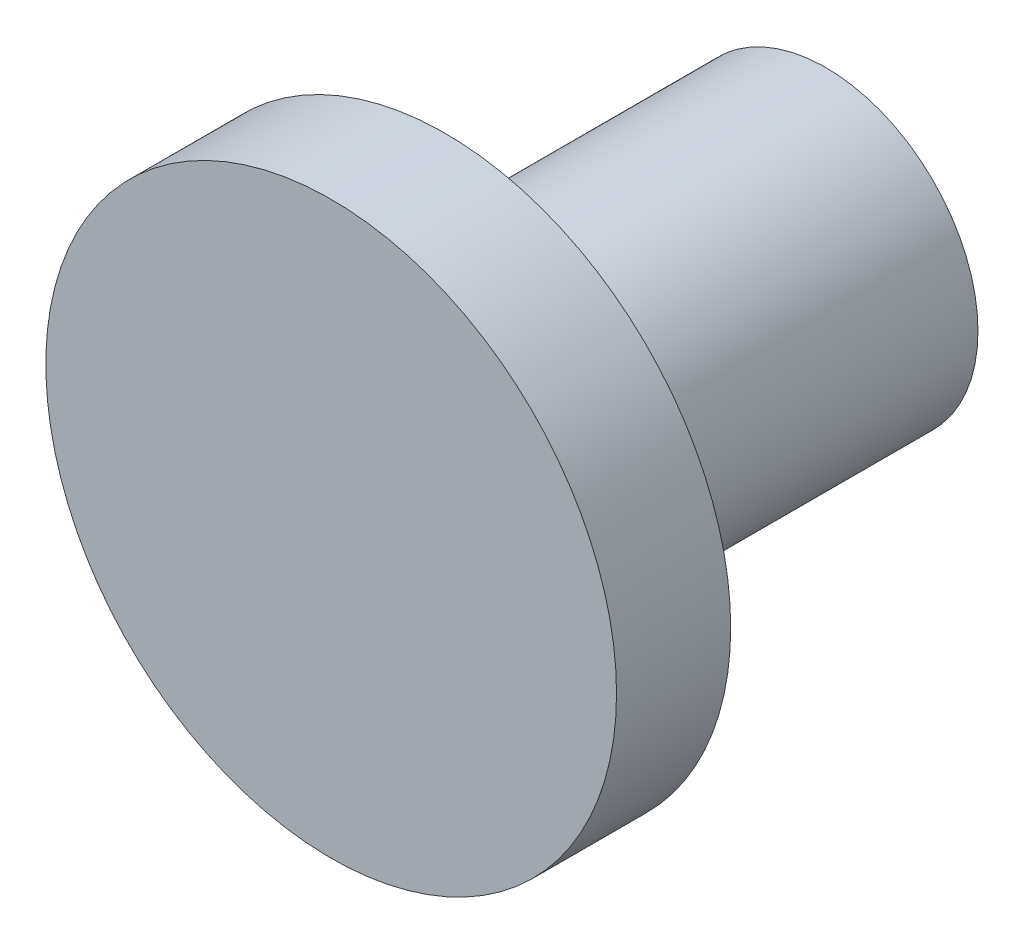
ISO-10303-21;
HEADER;
FILE_DESCRIPTION(('STEP AP214'),'2;1');
FILE_NAME('part.step','',(''),(''),'','','');
FILE_SCHEMA(('AUTOMOTIVE_DESIGN { 1 0 10303 214 1 1 1 1 }'));
ENDSEC;
DATA;
#1=APPLICATION_CONTEXT('core data for automotive mechanical design processes');
#2=APPLICATION_PROTOCOL_DEFINITION('international standard','automotive_design',2000,#1);
#3=PRODUCT_CONTEXT('',#1,'mechanical');
#4=PRODUCT('Part','Part','',(#3));
#5=PRODUCT_RELATED_PRODUCT_CATEGORY('part','',(#4));
#6=PRODUCT_DEFINITION_FORMATION('','',#4);
#7=PRODUCT_DEFINITION_CONTEXT('part definition',#1,'design');
#8=PRODUCT_DEFINITION('design','',#6,#7);
#9=PRODUCT_DEFINITION_SHAPE('','',#8);
#10=(LENGTH_UNIT() NAMED_UNIT(*) SI_UNIT(.MILLI.,.METRE.));
#11=(NAMED_UNIT(*) PLANE_ANGLE_UNIT() SI_UNIT($,.RADIAN.));
#12=(NAMED_UNIT(*) SI_UNIT($,.STERADIAN.) SOLID_ANGLE_UNIT());
#13=UNCERTAINTY_MEASURE_WITH_UNIT(LENGTH_MEASURE(1.E-05),#10,'distance_accuracy_value','');
#14=(GEOMETRIC_REPRESENTATION_CONTEXT(3) GLOBAL_UNCERTAINTY_ASSIGNED_CONTEXT((#13)) GLOBAL_UNIT_ASSIGNED_CONTEXT((#10,
#11,#12)) REPRESENTATION_CONTEXT('',''));
#15=CARTESIAN_POINT('',(0.,0.,0.));
#16=DIRECTION('',(0.,0.,1.));
#17=DIRECTION('',(1.,0.,0.));
#18=AXIS2_PLACEMENT_3D('',#15,#16,#17);
#19=CARTESIAN_POINT('',(0.,0.,10.));
#20=DIRECTION('',(0.,0.,-1.));
#21=DIRECTION('',(-1.,0.,0.));
#22=AXIS2_PLACEMENT_3D('',#19,#20,#21);
#23=CYLINDRICAL_SURFACE('',#22,4.);
#24=CARTESIAN_POINT('',(0.,0.,10.));
#25=DIRECTION('',(0.,0.,1.));
#26=DIRECTION('',(1.,0.,0.));
#27=AXIS2_PLACEMENT_3D('',#24,#25,#26);
#28=CIRCLE('',#27,4.);
#29=CARTESIAN_POINT('',(4.,0.,10.));
#30=VERTEX_POINT('',#29);
#31=EDGE_CURVE('E10',#30,#30,#28,.T.);
#32=ORIENTED_EDGE('',*,*,#31,.F.);
#33=EDGE_LOOP('',(#32));
#34=FACE_BOUND('',#33,.T.);
#35=CARTESIAN_POINT('',(0.,0.,0.));
#36=DIRECTION('',(0.,0.,1.));
#37=DIRECTION('',(1.,0.,0.));
#38=AXIS2_PLACEMENT_3D('',#35,#36,#37);
#39=CIRCLE('',#38,4.);
#40=CARTESIAN_POINT('',(4.,0.,0.));
#41=VERTEX_POINT('',#40);
#42=EDGE_CURVE('E42',#41,#41,#39,.T.);
#43=ORIENTED_EDGE('',*,*,#42,.T.);
#44=EDGE_LOOP('',(#43));
#45=FACE_BOUND('',#44,.T.);
#46=ADVANCED_FACE('F39',(#34,#45),#23,.T.);
#47=CARTESIAN_POINT('',(0.,0.,0.));
#48=DIRECTION('',(0.,0.,1.));
#49=DIRECTION('',(1.,0.,0.));
#50=AXIS2_PLACEMENT_3D('',#47,#48,#49);
#51=PLANE('',#50);
#52=CARTESIAN_POINT('',(0.,0.,0.));
#53=DIRECTION('',(0.,0.,-1.));
#54=DIRECTION('',(-1.,0.,0.));
#55=AXIS2_PLACEMENT_3D('',#52,#53,#54);
#56=CIRCLE('',#55,1.25);
#57=CARTESIAN_POINT('',(-1.25,0.,0.));
#58=VERTEX_POINT('',#57);
#59=EDGE_CURVE('E58',#58,#58,#56,.T.);
#60=ORIENTED_EDGE('',*,*,#59,.F.);
#61=EDGE_LOOP('',(#60));
#62=FACE_BOUND('',#61,.T.);
#63=ORIENTED_EDGE('',*,*,#42,.F.);
#64=EDGE_LOOP('',(#63));
#65=FACE_BOUND('',#64,.T.);
#66=ADVANCED_FACE('F74',(#62,#65),#51,.F.);
#67=CARTESIAN_POINT('',(0.,0.,10.));
#68=DIRECTION('',(0.,0.,1.));
#69=DIRECTION('',(1.,0.,0.));
#70=AXIS2_PLACEMENT_3D('',#67,#68,#69);
#71=PLANE('',#70);
#72=CARTESIAN_POINT('',(0.,0.,10.));
#73=DIRECTION('',(0.,0.,1.));
#74=DIRECTION('',(1.,0.,0.));
#75=AXIS2_PLACEMENT_3D('',#72,#73,#74);
#76=CIRCLE('',#75,7.5);
#77=CARTESIAN_POINT('',(7.5,0.,10.));
#78=VERTEX_POINT('',#77);
#79=EDGE_CURVE('E52',#78,#78,#76,.T.);
#80=ORIENTED_EDGE('',*,*,#79,.F.);
#81=EDGE_LOOP('',(#80));
#82=FACE_BOUND('',#81,.T.);
#83=ORIENTED_EDGE('',*,*,#31,.T.);
#84=EDGE_LOOP('',(#83));
#85=FACE_BOUND('',#84,.T.);
#86=ADVANCED_FACE('F77',(#82,#85),#71,.F.);
#87=CARTESIAN_POINT('',(0.,0.,13.));
#88=DIRECTION('',(0.,0.,-1.));
#89=DIRECTION('',(-1.,0.,0.));
#90=AXIS2_PLACEMENT_3D('',#87,#88,#89);
#91=CYLINDRICAL_SURFACE('',#90,7.5);
#92=CARTESIAN_POINT('',(0.,0.,13.));
#93=DIRECTION('',(0.,0.,1.));
#94=DIRECTION('',(1.,0.,0.));
#95=AXIS2_PLACEMENT_3D('',#92,#93,#94);
#96=CIRCLE('',#95,7.5);
#97=CARTESIAN_POINT('',(7.5,0.,13.));
#98=VERTEX_POINT('',#97);
#99=EDGE_CURVE('E50',#98,#98,#96,.T.);
#100=ORIENTED_EDGE('',*,*,#99,.F.);
#101=EDGE_LOOP('',(#100));
#102=FACE_BOUND('',#101,.T.);
#103=ORIENTED_EDGE('',*,*,#79,.T.);
#104=EDGE_LOOP('',(#103));
#105=FACE_BOUND('',#104,.T.);
#106=ADVANCED_FACE('F93',(#102,#105),#91,.T.);
#107=CARTESIAN_POINT('',(0.,0.,13.));
#108=DIRECTION('',(0.,0.,1.));
#109=DIRECTION('',(1.,0.,0.));
#110=AXIS2_PLACEMENT_3D('',#107,#108,#109);
#111=PLANE('',#110);
#112=ORIENTED_EDGE('',*,*,#99,.T.);
#113=EDGE_LOOP('',(#112));
#114=FACE_BOUND('',#113,.T.);
#115=ADVANCED_FACE('F70',(#114),#111,.T.);
#116=CARTESIAN_POINT('',(0.,0.,10.));
#117=DIRECTION('',(0.,0.,-1.));
#118=DIRECTION('',(-1.,0.,0.));
#119=AXIS2_PLACEMENT_3D('',#116,#117,#118);
#120=CYLINDRICAL_SURFACE('',#119,1.25);
#121=CARTESIAN_POINT('',(0.,0.,10.));
#122=DIRECTION('',(0.,0.,-1.));
#123=DIRECTION('',(-1.,0.,0.));
#124=AXIS2_PLACEMENT_3D('',#121,#122,#123);
#125=CIRCLE('',#124,1.25);
#126=CARTESIAN_POINT('',(-1.25,0.,10.));
#127=VERTEX_POINT('',#126);
#128=EDGE_CURVE('E55',#127,#127,#125,.T.);
#129=ORIENTED_EDGE('',*,*,#128,.F.);
#130=EDGE_LOOP('',(#129));
#131=FACE_BOUND('',#130,.T.);
#132=ORIENTED_EDGE('',*,*,#59,.T.);
#133=EDGE_LOOP('',(#132));
#134=FACE_BOUND('',#133,.T.);
#135=ADVANCED_FACE('F67',(#131,#134),#120,.F.);
#136=CARTESIAN_POINT('',(0.,0.,10.));
#137=DIRECTION('',(0.,0.,-1.));
#138=DIRECTION('',(-1.,0.,0.));
#139=AXIS2_PLACEMENT_3D('',#136,#137,#138);
#140=PLANE('',#139);
#141=ORIENTED_EDGE('',*,*,#128,.T.);
#142=EDGE_LOOP('',(#141));
#143=FACE_BOUND('',#142,.T.);
#144=ADVANCED_FACE('F65',(#143),#140,.T.);
#145=CLOSED_SHELL('',(#46,#66,#86,#106,#115,#135,#144));
#146=MANIFOLD_SOLID_BREP('B2',#145);
#147=ADVANCED_BREP_SHAPE_REPRESENTATION('',(#18,#146),#14);
#148=SHAPE_DEFINITION_REPRESENTATION(#9,#147);
ENDSEC;
END-ISO-10303-21;
